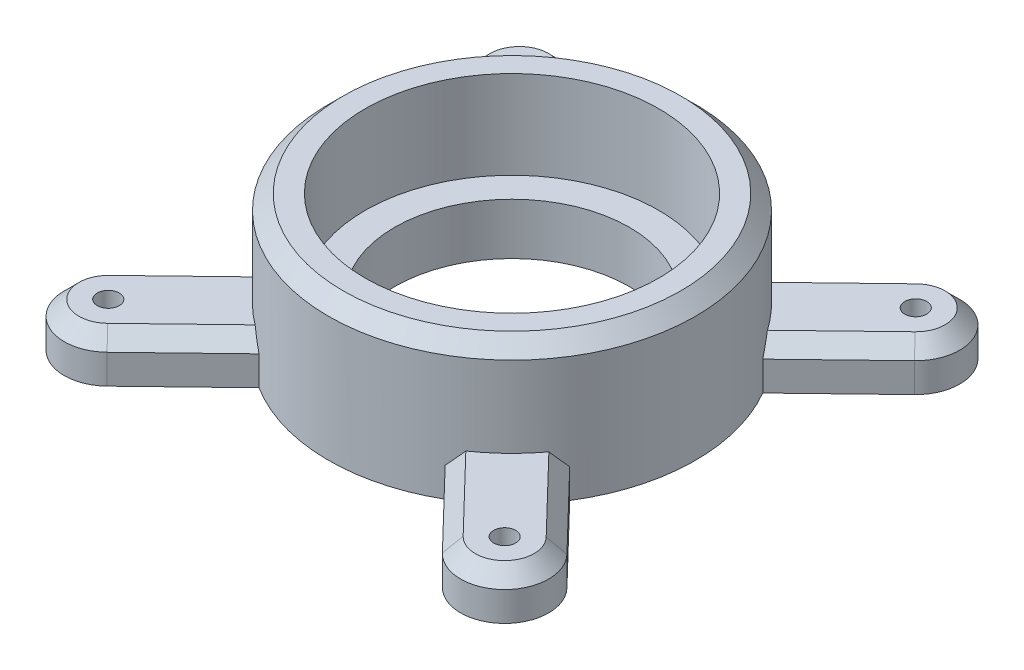
ISO-10303-21;
HEADER;
FILE_DESCRIPTION(('STEP AP214'),'2;1');
FILE_NAME('part.step','',(''),(''),'','','');
FILE_SCHEMA(('AUTOMOTIVE_DESIGN { 1 0 10303 214 1 1 1 1 }'));
ENDSEC;
DATA;
#1=APPLICATION_CONTEXT('core data for automotive mechanical design processes');
#2=APPLICATION_PROTOCOL_DEFINITION('international standard','automotive_design',2000,#1);
#3=PRODUCT_CONTEXT('',#1,'mechanical');
#4=PRODUCT('Part','Part','',(#3));
#5=PRODUCT_RELATED_PRODUCT_CATEGORY('part','',(#4));
#6=PRODUCT_DEFINITION_FORMATION('','',#4);
#7=PRODUCT_DEFINITION_CONTEXT('part definition',#1,'design');
#8=PRODUCT_DEFINITION('design','',#6,#7);
#9=PRODUCT_DEFINITION_SHAPE('','',#8);
#10=(LENGTH_UNIT() NAMED_UNIT(*) SI_UNIT(.MILLI.,.METRE.));
#11=(NAMED_UNIT(*) PLANE_ANGLE_UNIT() SI_UNIT($,.RADIAN.));
#12=(NAMED_UNIT(*) SI_UNIT($,.STERADIAN.) SOLID_ANGLE_UNIT());
#13=UNCERTAINTY_MEASURE_WITH_UNIT(LENGTH_MEASURE(1.E-05),#10,'distance_accuracy_value','');
#14=(GEOMETRIC_REPRESENTATION_CONTEXT(3) GLOBAL_UNCERTAINTY_ASSIGNED_CONTEXT((#13)) GLOBAL_UNIT_ASSIGNED_CONTEXT((#10,
#11,#12)) REPRESENTATION_CONTEXT('',''));
#15=CARTESIAN_POINT('',(0.,0.,0.));
#16=DIRECTION('',(0.,0.,1.));
#17=DIRECTION('',(1.,0.,0.));
#18=AXIS2_PLACEMENT_3D('',#15,#16,#17);
#19=CARTESIAN_POINT('',(-27.,0.,-28.));
#20=DIRECTION('',(0.,1.,0.));
#21=DIRECTION('',(0.,0.,1.));
#22=AXIS2_PLACEMENT_3D('',#19,#20,#21);
#23=PLANE('',#22);
#24=CARTESIAN_POINT('',(28.0000000000001,0.,-26.9999999999999));
#25=DIRECTION('',(0.,-1.,0.));
#26=DIRECTION('',(0.,0.,-1.));
#27=AXIS2_PLACEMENT_3D('',#24,#25,#26);
#28=CIRCLE('',#27,1.49999999999999);
#29=CARTESIAN_POINT('',(28.0000000000001,0.,-28.4999999999999));
#30=VERTEX_POINT('',#29);
#31=EDGE_CURVE('E661',#30,#30,#28,.T.);
#32=ORIENTED_EDGE('',*,*,#31,.F.);
#33=EDGE_LOOP('',(#32));
#34=FACE_BOUND('',#33,.T.);
#35=CARTESIAN_POINT('',(26.9999999999998,0.,28.0000000000002));
#36=DIRECTION('',(0.,-1.,0.));
#37=DIRECTION('',(0.,0.,-1.));
#38=AXIS2_PLACEMENT_3D('',#35,#36,#37);
#39=CIRCLE('',#38,1.49999999999999);
#40=CARTESIAN_POINT('',(26.9999999999998,0.,26.5000000000002));
#41=VERTEX_POINT('',#40);
#42=EDGE_CURVE('E671',#41,#41,#39,.T.);
#43=ORIENTED_EDGE('',*,*,#42,.F.);
#44=EDGE_LOOP('',(#43));
#45=FACE_BOUND('',#44,.T.);
#46=CARTESIAN_POINT('',(-28.0000000000003,0.,26.9999999999997));
#47=DIRECTION('',(0.,-1.,0.));
#48=DIRECTION('',(0.,0.,-1.));
#49=AXIS2_PLACEMENT_3D('',#46,#47,#48);
#50=CIRCLE('',#49,1.49999999999999);
#51=CARTESIAN_POINT('',(-28.0000000000003,0.,25.4999999999997));
#52=VERTEX_POINT('',#51);
#53=EDGE_CURVE('E679',#52,#52,#50,.T.);
#54=ORIENTED_EDGE('',*,*,#53,.F.);
#55=EDGE_LOOP('',(#54));
#56=FACE_BOUND('',#55,.T.);
#57=CARTESIAN_POINT('',(0.,0.,0.));
#58=DIRECTION('',(0.,1.,0.));
#59=DIRECTION('',(0.,0.,1.));
#60=AXIS2_PLACEMENT_3D('',#57,#58,#59);
#61=CIRCLE('',#60,16.);
#62=CARTESIAN_POINT('',(0.,0.,16.));
#63=VERTEX_POINT('',#62);
#64=EDGE_CURVE('E344',#63,#63,#61,.T.);
#65=ORIENTED_EDGE('',*,*,#64,.T.);
#66=EDGE_LOOP('',(#65));
#67=FACE_BOUND('',#66,.T.);
#68=CARTESIAN_POINT('',(-27.,0.,-28.));
#69=DIRECTION('',(0.,1.,0.));
#70=DIRECTION('',(0.,0.,1.));
#71=AXIS2_PLACEMENT_3D('',#68,#69,#70);
#72=CIRCLE('',#71,6.00000000000002);
#73=CARTESIAN_POINT('',(-22.6809342274759,0.,-32.1648134235054));
#74=VERTEX_POINT('',#73);
#75=CARTESIAN_POINT('',(-31.3190657725241,0.,-23.8351865764946));
#76=VERTEX_POINT('',#75);
#77=EDGE_CURVE('E227',#74,#76,#72,.T.);
#78=ORIENTED_EDGE('',*,*,#77,.F.);
#79=DIRECTION('',(-0.694135570584231,0.,-0.719844295420686));
#80=VECTOR('',#79,1.);
#81=CARTESIAN_POINT('',(-12.5271340397874,0.,-21.6349465621988));
#82=LINE('',#81,#80);
#83=CARTESIAN_POINT('',(-12.5271340397874,0.,-21.6349465621989));
#84=VERTEX_POINT('',#83);
#85=EDGE_CURVE('E298',#84,#74,#82,.T.);
#86=ORIENTED_EDGE('',*,*,#85,.F.);
#87=CARTESIAN_POINT('',(0.,0.,0.));
#88=DIRECTION('',(0.,1.,0.));
#89=DIRECTION('',(0.,0.,1.));
#90=AXIS2_PLACEMENT_3D('',#87,#88,#89);
#91=CIRCLE('',#90,25.);
#92=CARTESIAN_POINT('',(13.3053197151881,0.,-21.1652655848356));
#93=VERTEX_POINT('',#92);
#94=EDGE_CURVE('E294',#93,#84,#91,.T.);
#95=ORIENTED_EDGE('',*,*,#94,.F.);
#96=DIRECTION('',(-0.719844295420688,0.,0.694135570584229));
#97=VECTOR('',#96,1.);
#98=CARTESIAN_POINT('',(13.3053197151881,0.,-21.1652655848356));
#99=LINE('',#98,#97);
#100=CARTESIAN_POINT('',(23.8351865764947,0.,-31.319065772524));
#101=VERTEX_POINT('',#100);
#102=EDGE_CURVE('E290',#101,#93,#99,.T.);
#103=ORIENTED_EDGE('',*,*,#102,.F.);
#104=CARTESIAN_POINT('',(28.0000000000001,0.,-26.9999999999999));
#105=DIRECTION('',(0.,1.,0.));
#106=DIRECTION('',(0.,0.,1.));
#107=AXIS2_PLACEMENT_3D('',#104,#105,#106);
#108=CIRCLE('',#107,6.);
#109=CARTESIAN_POINT('',(32.1648134235055,0.,-22.6809342274758));
#110=VERTEX_POINT('',#109);
#111=EDGE_CURVE('E286',#110,#101,#108,.T.);
#112=ORIENTED_EDGE('',*,*,#111,.F.);
#113=DIRECTION('',(0.719844295420687,0.,-0.69413557058423));
#114=VECTOR('',#113,1.);
#115=CARTESIAN_POINT('',(21.6349465621989,0.,-12.5271340397873));
#116=LINE('',#115,#114);
#117=CARTESIAN_POINT('',(21.6349465621989,0.,-12.5271340397873));
#118=VERTEX_POINT('',#117);
#119=EDGE_CURVE('E282',#118,#110,#116,.T.);
#120=ORIENTED_EDGE('',*,*,#119,.F.);
#121=CARTESIAN_POINT('',(0.,0.,0.));
#122=DIRECTION('',(0.,1.,0.));
#123=DIRECTION('',(0.,0.,1.));
#124=AXIS2_PLACEMENT_3D('',#121,#122,#123);
#125=CIRCLE('',#124,25.);
#126=CARTESIAN_POINT('',(21.165265584836,0.,13.3053197151874));
#127=VERTEX_POINT('',#126);
#128=EDGE_CURVE('E278',#127,#118,#125,.T.);
#129=ORIENTED_EDGE('',*,*,#128,.F.);
#130=DIRECTION('',(-0.694135570584231,0.,-0.719844295420686));
#131=VECTOR('',#130,1.);
#132=CARTESIAN_POINT('',(21.165265584836,0.,13.3053197151874));
#133=LINE('',#132,#131);
#134=CARTESIAN_POINT('',(31.3190657725238,0.,23.8351865764947));
#135=VERTEX_POINT('',#134);
#136=EDGE_CURVE('E274',#135,#127,#133,.T.);
#137=ORIENTED_EDGE('',*,*,#136,.F.);
#138=CARTESIAN_POINT('',(26.9999999999998,0.,28.0000000000002));
#139=DIRECTION('',(0.,1.,0.));
#140=DIRECTION('',(0.,0.,1.));
#141=AXIS2_PLACEMENT_3D('',#138,#139,#140);
#142=CIRCLE('',#141,6.00000000000002);
#143=CARTESIAN_POINT('',(22.6809342274763,0.,32.1648134235048));
#144=VERTEX_POINT('',#143);
#145=EDGE_CURVE('E270',#144,#135,#142,.T.);
#146=ORIENTED_EDGE('',*,*,#145,.F.);
#147=DIRECTION('',(0.694135570584231,0.,0.719844295420686));
#148=VECTOR('',#147,1.);
#149=CARTESIAN_POINT('',(12.5271340397878,0.,21.6349465621982));
#150=LINE('',#149,#148);
#151=CARTESIAN_POINT('',(12.5271340397879,0.,21.6349465621984));
#152=VERTEX_POINT('',#151);
#153=EDGE_CURVE('E266',#152,#144,#150,.T.);
#154=ORIENTED_EDGE('',*,*,#153,.F.);
#155=CARTESIAN_POINT('',(0.,0.,0.));
#156=DIRECTION('',(0.,1.,0.));
#157=DIRECTION('',(0.,0.,1.));
#158=AXIS2_PLACEMENT_3D('',#155,#156,#157);
#159=CIRCLE('',#158,24.9999999999998);
#160=CARTESIAN_POINT('',(-13.3053197151883,0.,21.1652655848355));
#161=VERTEX_POINT('',#160);
#162=EDGE_CURVE('E262',#161,#152,#159,.T.);
#163=ORIENTED_EDGE('',*,*,#162,.F.);
#164=DIRECTION('',(0.719844295420659,0.,-0.694135570584259));
#165=VECTOR('',#164,1.);
#166=CARTESIAN_POINT('',(-13.3053197151883,0.,21.1652655848355));
#167=LINE('',#166,#165);
#168=CARTESIAN_POINT('',(-23.8351865764946,0.,31.3190657725235));
#169=VERTEX_POINT('',#168);
#170=EDGE_CURVE('E258',#169,#161,#167,.T.);
#171=ORIENTED_EDGE('',*,*,#170,.F.);
#172=CARTESIAN_POINT('',(-28.0000000000003,0.,26.9999999999997));
#173=DIRECTION('',(0.,1.,0.));
#174=DIRECTION('',(0.,0.,1.));
#175=AXIS2_PLACEMENT_3D('',#172,#173,#174);
#176=CIRCLE('',#175,6.00000000000002);
#177=CARTESIAN_POINT('',(-32.1648134235049,0.,22.6809342274758));
#178=VERTEX_POINT('',#177);
#179=EDGE_CURVE('E254',#178,#169,#176,.T.);
#180=ORIENTED_EDGE('',*,*,#179,.F.);
#181=DIRECTION('',(-0.719844295420661,0.,0.694135570584257));
#182=VECTOR('',#181,1.);
#183=CARTESIAN_POINT('',(-21.634946562199,0.,12.5271340397872));
#184=LINE('',#183,#182);
#185=CARTESIAN_POINT('',(-21.634946562199,0.,12.5271340397872));
#186=VERTEX_POINT('',#185);
#187=EDGE_CURVE('E250',#186,#178,#184,.T.);
#188=ORIENTED_EDGE('',*,*,#187,.F.);
#189=CARTESIAN_POINT('',(0.,0.,0.));
#190=DIRECTION('',(0.,1.,0.));
#191=DIRECTION('',(0.,0.,1.));
#192=AXIS2_PLACEMENT_3D('',#189,#190,#191);
#193=CIRCLE('',#192,25.);
#194=CARTESIAN_POINT('',(-21.1652655848356,0.,-13.3053197151881));
#195=VERTEX_POINT('',#194);
#196=EDGE_CURVE('E230',#195,#186,#193,.T.);
#197=ORIENTED_EDGE('',*,*,#196,.F.);
#198=DIRECTION('',(0.694135570584232,0.,0.719844295420685));
#199=VECTOR('',#198,1.);
#200=CARTESIAN_POINT('',(-21.1652655848356,0.,-13.3053197151881));
#201=LINE('',#200,#199);
#202=EDGE_CURVE('E214',#76,#195,#201,.T.);
#203=ORIENTED_EDGE('',*,*,#202,.F.);
#204=EDGE_LOOP('',(#78,#86,#95,#103,#112,#120,#129,#137,#146,#154,#163,#171,#180,#188,#197,#203));
#205=FACE_BOUND('',#204,.T.);
#206=CARTESIAN_POINT('',(-27.,0.,-28.));
#207=DIRECTION('',(0.,-1.,0.));
#208=DIRECTION('',(0.,0.,-1.));
#209=AXIS2_PLACEMENT_3D('',#206,#207,#208);
#210=CIRCLE('',#209,1.49999999999999);
#211=CARTESIAN_POINT('',(-27.,0.,-29.5));
#212=VERTEX_POINT('',#211);
#213=EDGE_CURVE('E461',#212,#212,#210,.T.);
#214=ORIENTED_EDGE('',*,*,#213,.F.);
#215=EDGE_LOOP('',(#214));
#216=FACE_BOUND('',#215,.T.);
#217=ADVANCED_FACE('F49',(#34,#45,#56,#67,#205,#216),#23,.F.);
#218=CARTESIAN_POINT('',(-27.,6.,-28.));
#219=DIRECTION('',(0.,1.,0.));
#220=DIRECTION('',(0.,0.,1.));
#221=AXIS2_PLACEMENT_3D('',#218,#219,#220);
#222=PLANE('',#221);
#223=CARTESIAN_POINT('',(26.9999999999998,6.,28.0000000000002));
#224=DIRECTION('',(0.,1.,0.));
#225=DIRECTION('',(0.,0.,1.));
#226=AXIS2_PLACEMENT_3D('',#223,#224,#225);
#227=CIRCLE('',#226,1.49999999999999);
#228=CARTESIAN_POINT('',(26.9999999999998,6.,29.5000000000002));
#229=VERTEX_POINT('',#228);
#230=EDGE_CURVE('E675',#229,#229,#227,.T.);
#231=ORIENTED_EDGE('',*,*,#230,.F.);
#232=EDGE_LOOP('',(#231));
#233=FACE_BOUND('',#232,.T.);
#234=CARTESIAN_POINT('',(26.9999999999998,6.,28.0000000000002));
#235=DIRECTION('',(0.,1.,0.));
#236=DIRECTION('',(0.,0.,1.));
#237=AXIS2_PLACEMENT_3D('',#234,#235,#236);
#238=CIRCLE('',#237,4.00000000000002);
#239=CARTESIAN_POINT('',(24.1206228183177,6.,30.7765422823364));
#240=VERTEX_POINT('',#239);
#241=CARTESIAN_POINT('',(29.8793771816824,6.,25.2234577176631));
#242=VERTEX_POINT('',#241);
#243=EDGE_CURVE('E380',#240,#242,#238,.T.);
#244=ORIENTED_EDGE('',*,*,#243,.T.);
#245=DIRECTION('',(-0.694135570584231,0.,-0.719844295420686));
#246=VECTOR('',#245,1.);
#247=CARTESIAN_POINT('',(19.7255769939947,6.,14.6935908563559));
#248=LINE('',#247,#246);
#249=CARTESIAN_POINT('',(20.0092029812449,6.,14.9877215098006));
#250=VERTEX_POINT('',#249);
#251=EDGE_CURVE('E383',#242,#250,#248,.T.);
#252=ORIENTED_EDGE('',*,*,#251,.T.);
#253=CARTESIAN_POINT('',(0.,6.,0.));
#254=DIRECTION('',(0.,1.,0.));
#255=DIRECTION('',(0.,0.,1.));
#256=AXIS2_PLACEMENT_3D('',#253,#254,#255);
#257=CIRCLE('',#256,25.);
#258=CARTESIAN_POINT('',(14.2504486178796,6.,20.5408060744746));
#259=VERTEX_POINT('',#258);
#260=EDGE_CURVE('E238',#259,#250,#257,.T.);
#261=ORIENTED_EDGE('',*,*,#260,.F.);
#262=DIRECTION('',(0.694135570584231,0.,0.719844295420686));
#263=VECTOR('',#262,1.);
#264=CARTESIAN_POINT('',(24.1206228183176,6.,30.7765422823363));
#265=LINE('',#264,#263);
#266=EDGE_CURVE('E377',#259,#240,#265,.T.);
#267=ORIENTED_EDGE('',*,*,#266,.T.);
#268=EDGE_LOOP('',(#244,#252,#261,#267));
#269=FACE_BOUND('',#268,.T.);
#270=ADVANCED_FACE('F543',(#233,#269),#222,.T.);
#271=CARTESIAN_POINT('',(28.0000000000001,6.,-26.9999999999999));
#272=DIRECTION('',(0.,1.,0.));
#273=DIRECTION('',(0.,0.,1.));
#274=AXIS2_PLACEMENT_3D('',#271,#272,#273);
#275=CIRCLE('',#274,1.49999999999999);
#276=CARTESIAN_POINT('',(28.0000000000001,6.,-25.4999999999999));
#277=VERTEX_POINT('',#276);
#278=EDGE_CURVE('E667',#277,#277,#275,.T.);
#279=ORIENTED_EDGE('',*,*,#278,.F.);
#280=EDGE_LOOP('',(#279));
#281=FACE_BOUND('',#280,.T.);
#282=CARTESIAN_POINT('',(20.5408060744751,6.,-14.2504486178789));
#283=VERTEX_POINT('',#282);
#284=CARTESIAN_POINT('',(14.9877215098013,6.,-20.0092029812444));
#285=VERTEX_POINT('',#284);
#286=EDGE_CURVE('E244',#283,#285,#257,.T.);
#287=ORIENTED_EDGE('',*,*,#286,.F.);
#288=DIRECTION('',(0.719844295420687,0.,-0.69413557058423));
#289=VECTOR('',#288,1.);
#290=CARTESIAN_POINT('',(30.776542282337,6.,-24.1206228183171));
#291=LINE('',#290,#289);
#292=CARTESIAN_POINT('',(30.776542282337,6.,-24.1206228183171));
#293=VERTEX_POINT('',#292);
#294=EDGE_CURVE('E364',#283,#293,#291,.T.);
#295=ORIENTED_EDGE('',*,*,#294,.T.);
#296=CARTESIAN_POINT('',(28.0000000000001,6.,-26.9999999999999));
#297=DIRECTION('',(0.,1.,0.));
#298=DIRECTION('',(0.,0.,1.));
#299=AXIS2_PLACEMENT_3D('',#296,#297,#298);
#300=CIRCLE('',#299,3.99999999999999);
#301=CARTESIAN_POINT('',(25.2234577176632,6.,-29.8793771816826));
#302=VERTEX_POINT('',#301);
#303=EDGE_CURVE('E361',#293,#302,#300,.T.);
#304=ORIENTED_EDGE('',*,*,#303,.T.);
#305=DIRECTION('',(-0.719844295420688,0.,0.694135570584229));
#306=VECTOR('',#305,1.);
#307=CARTESIAN_POINT('',(14.6935908563566,6.,-19.7255769939942));
#308=LINE('',#307,#306);
#309=EDGE_CURVE('E358',#302,#285,#308,.T.);
#310=ORIENTED_EDGE('',*,*,#309,.T.);
#311=EDGE_LOOP('',(#287,#295,#304,#310));
#312=FACE_BOUND('',#311,.T.);
#313=ADVANCED_FACE('F575',(#281,#312),#222,.T.);
#314=CARTESIAN_POINT('',(-27.,6.,-28.));
#315=DIRECTION('',(0.,1.,0.));
#316=DIRECTION('',(0.,0.,1.));
#317=AXIS2_PLACEMENT_3D('',#314,#315,#316);
#318=CIRCLE('',#317,1.49999999999999);
#319=CARTESIAN_POINT('',(-27.,6.,-26.5));
#320=VERTEX_POINT('',#319);
#321=EDGE_CURVE('E655',#320,#320,#318,.T.);
#322=ORIENTED_EDGE('',*,*,#321,.F.);
#323=EDGE_LOOP('',(#322));
#324=FACE_BOUND('',#323,.T.);
#325=CARTESIAN_POINT('',(-14.250448617879,6.,-20.540806074475));
#326=VERTEX_POINT('',#325);
#327=CARTESIAN_POINT('',(-20.0092029812445,6.,-14.9877215098012));
#328=VERTEX_POINT('',#327);
#329=EDGE_CURVE('E245',#326,#328,#257,.T.);
#330=ORIENTED_EDGE('',*,*,#329,.F.);
#331=DIRECTION('',(-0.694135570584231,0.,-0.719844295420686));
#332=VECTOR('',#331,1.);
#333=CARTESIAN_POINT('',(-24.1206228183172,6.,-30.7765422823369));
#334=LINE('',#333,#332);
#335=CARTESIAN_POINT('',(-24.1206228183172,6.,-30.7765422823369));
#336=VERTEX_POINT('',#335);
#337=EDGE_CURVE('E421',#326,#336,#334,.T.);
#338=ORIENTED_EDGE('',*,*,#337,.T.);
#339=CARTESIAN_POINT('',(-27.,6.,-28.));
#340=DIRECTION('',(0.,1.,0.));
#341=DIRECTION('',(0.,0.,1.));
#342=AXIS2_PLACEMENT_3D('',#339,#340,#341);
#343=CIRCLE('',#342,4.00000000000001);
#344=CARTESIAN_POINT('',(-29.8793771816827,6.,-25.2234577176631));
#345=VERTEX_POINT('',#344);
#346=EDGE_CURVE('E418',#336,#345,#343,.T.);
#347=ORIENTED_EDGE('',*,*,#346,.T.);
#348=DIRECTION('',(0.694135570584232,0.,0.719844295420685));
#349=VECTOR('',#348,1.);
#350=CARTESIAN_POINT('',(-19.7255769939943,6.,-14.6935908563565));
#351=LINE('',#350,#349);
#352=EDGE_CURVE('E415',#345,#328,#351,.T.);
#353=ORIENTED_EDGE('',*,*,#352,.T.);
#354=EDGE_LOOP('',(#330,#338,#347,#353));
#355=FACE_BOUND('',#354,.T.);
#356=ADVANCED_FACE('F492',(#324,#355),#222,.T.);
#357=CARTESIAN_POINT('',(-27.,6.,-28.));
#358=DIRECTION('',(0.,-1.,0.));
#359=DIRECTION('',(0.,0.,-1.));
#360=AXIS2_PLACEMENT_3D('',#357,#358,#359);
#361=CYLINDRICAL_SURFACE('',#360,6.00000000000002);
#362=DIRECTION('',(0.,-1.,0.));
#363=VECTOR('',#362,1.);
#364=CARTESIAN_POINT('',(-31.3190657725241,6.,-23.8351865764946));
#365=LINE('',#364,#363);
#366=CARTESIAN_POINT('',(-31.3190657725241,3.99999999999998,-23.8351865764946));
#367=VERTEX_POINT('',#366);
#368=EDGE_CURVE('E211',#367,#76,#365,.T.);
#369=ORIENTED_EDGE('',*,*,#368,.F.);
#370=CARTESIAN_POINT('',(-27.,3.99999999999998,-28.));
#371=DIRECTION('',(0.,1.,0.));
#372=DIRECTION('',(0.,0.,1.));
#373=AXIS2_PLACEMENT_3D('',#370,#371,#372);
#374=CIRCLE('',#373,6.00000000000002);
#375=CARTESIAN_POINT('',(-22.6809342274759,3.99999999999998,-32.1648134235054));
#376=VERTEX_POINT('',#375);
#377=EDGE_CURVE('E428',#367,#376,#374,.F.);
#378=ORIENTED_EDGE('',*,*,#377,.T.);
#379=DIRECTION('',(0.,-1.,0.));
#380=VECTOR('',#379,1.);
#381=CARTESIAN_POINT('',(-22.6809342274759,6.,-32.1648134235054));
#382=LINE('',#381,#380);
#383=EDGE_CURVE('E235',#376,#74,#382,.T.);
#384=ORIENTED_EDGE('',*,*,#383,.T.);
#385=ORIENTED_EDGE('',*,*,#77,.T.);
#386=EDGE_LOOP('',(#369,#378,#384,#385));
#387=FACE_BOUND('',#386,.T.);
#388=ADVANCED_FACE('F233',(#387),#361,.T.);
#389=CARTESIAN_POINT('',(-21.1652655848356,6.,-13.3053197151881));
#390=DIRECTION('',(0.719844295420685,0.,-0.694135570584232));
#391=DIRECTION('',(-0.694135570584232,0.,-0.719844295420685));
#392=AXIS2_PLACEMENT_3D('',#389,#390,#391);
#393=PLANE('',#392);
#394=DIRECTION('',(0.,-1.,0.));
#395=VECTOR('',#394,1.);
#396=CARTESIAN_POINT('',(-21.1652655848356,6.,-13.3053197151881));
#397=LINE('',#396,#395);
#398=CARTESIAN_POINT('',(-21.1652655848356,3.99999999999998,-13.3053197151881));
#399=VERTEX_POINT('',#398);
#400=EDGE_CURVE('E221',#399,#195,#397,.T.);
#401=ORIENTED_EDGE('',*,*,#400,.F.);
#402=DIRECTION('',(-0.694135570584232,0.,-0.719844295420685));
#403=VECTOR('',#402,1.);
#404=CARTESIAN_POINT('',(-31.3190657725241,3.99999999999998,-23.8351865764946));
#405=LINE('',#404,#403);
#406=EDGE_CURVE('E73',#399,#367,#405,.T.);
#407=ORIENTED_EDGE('',*,*,#406,.T.);
#408=ORIENTED_EDGE('',*,*,#368,.T.);
#409=ORIENTED_EDGE('',*,*,#202,.T.);
#410=EDGE_LOOP('',(#401,#407,#408,#409));
#411=FACE_BOUND('',#410,.T.);
#412=ADVANCED_FACE('F213',(#411),#393,.F.);
#413=CARTESIAN_POINT('',(-21.634946562199,6.,12.5271340397872));
#414=DIRECTION('',(0.694135570584257,0.,0.719844295420661));
#415=DIRECTION('',(0.719844295420661,0.,-0.694135570584257));
#416=AXIS2_PLACEMENT_3D('',#413,#414,#415);
#417=PLANE('',#416);
#418=DIRECTION('',(0.,-1.,0.));
#419=VECTOR('',#418,1.);
#420=CARTESIAN_POINT('',(-32.1648134235049,6.,22.6809342274758));
#421=LINE('',#420,#419);
#422=CARTESIAN_POINT('',(-32.1648134235049,3.99999999999998,22.6809342274758));
#423=VERTEX_POINT('',#422);
#424=EDGE_CURVE('E336',#423,#178,#421,.T.);
#425=ORIENTED_EDGE('',*,*,#424,.F.);
#426=DIRECTION('',(0.719844295420661,0.,-0.694135570584257));
#427=VECTOR('',#426,1.);
#428=CARTESIAN_POINT('',(-21.634946562199,3.99999999999998,12.5271340397872));
#429=LINE('',#428,#427);
#430=CARTESIAN_POINT('',(-21.634946562199,3.99999999999998,12.5271340397872));
#431=VERTEX_POINT('',#430);
#432=EDGE_CURVE('E412',#423,#431,#429,.T.);
#433=ORIENTED_EDGE('',*,*,#432,.T.);
#434=DIRECTION('',(0.,-1.,0.));
#435=VECTOR('',#434,1.);
#436=CARTESIAN_POINT('',(-21.634946562199,6.,12.5271340397872));
#437=LINE('',#436,#435);
#438=EDGE_CURVE('E339',#431,#186,#437,.T.);
#439=ORIENTED_EDGE('',*,*,#438,.T.);
#440=ORIENTED_EDGE('',*,*,#187,.T.);
#441=EDGE_LOOP('',(#425,#433,#439,#440));
#442=FACE_BOUND('',#441,.T.);
#443=ADVANCED_FACE('F725',(#442),#417,.F.);
#444=CARTESIAN_POINT('',(-28.0000000000003,6.,26.9999999999997));
#445=DIRECTION('',(0.,-1.,0.));
#446=DIRECTION('',(0.,0.,-1.));
#447=AXIS2_PLACEMENT_3D('',#444,#445,#446);
#448=CYLINDRICAL_SURFACE('',#447,6.00000000000002);
#449=DIRECTION('',(0.,-1.,0.));
#450=VECTOR('',#449,1.);
#451=CARTESIAN_POINT('',(-23.8351865764946,6.,31.3190657725235));
#452=LINE('',#451,#450);
#453=CARTESIAN_POINT('',(-23.8351865764946,3.99999999999998,31.3190657725235));
#454=VERTEX_POINT('',#453);
#455=EDGE_CURVE('E333',#454,#169,#452,.T.);
#456=ORIENTED_EDGE('',*,*,#455,.F.);
#457=CARTESIAN_POINT('',(-28.0000000000003,3.99999999999998,26.9999999999997));
#458=DIRECTION('',(0.,1.,0.));
#459=DIRECTION('',(0.,0.,1.));
#460=AXIS2_PLACEMENT_3D('',#457,#458,#459);
#461=CIRCLE('',#460,6.00000000000002);
#462=EDGE_CURVE('E409',#454,#423,#461,.F.);
#463=ORIENTED_EDGE('',*,*,#462,.T.);
#464=ORIENTED_EDGE('',*,*,#424,.T.);
#465=ORIENTED_EDGE('',*,*,#179,.T.);
#466=EDGE_LOOP('',(#456,#463,#464,#465));
#467=FACE_BOUND('',#466,.T.);
#468=ADVANCED_FACE('F525',(#467),#448,.T.);
#469=CARTESIAN_POINT('',(-13.3053197151883,6.,21.1652655848355));
#470=DIRECTION('',(-0.694135570584259,0.,-0.719844295420659));
#471=DIRECTION('',(-0.719844295420659,0.,0.694135570584259));
#472=AXIS2_PLACEMENT_3D('',#469,#470,#471);
#473=PLANE('',#472);
#474=DIRECTION('',(0.,-1.,0.));
#475=VECTOR('',#474,1.);
#476=CARTESIAN_POINT('',(-13.3053197151883,6.,21.1652655848355));
#477=LINE('',#476,#475);
#478=CARTESIAN_POINT('',(-13.3053197151883,3.99999999999999,21.1652655848355));
#479=VERTEX_POINT('',#478);
#480=EDGE_CURVE('E330',#479,#161,#477,.T.);
#481=ORIENTED_EDGE('',*,*,#480,.F.);
#482=DIRECTION('',(-0.719844295420659,0.,0.694135570584259));
#483=VECTOR('',#482,1.);
#484=CARTESIAN_POINT('',(-23.8351865764941,3.99999999999999,31.319065772524));
#485=LINE('',#484,#483);
#486=EDGE_CURVE('E406',#479,#454,#485,.T.);
#487=ORIENTED_EDGE('',*,*,#486,.T.);
#488=ORIENTED_EDGE('',*,*,#455,.T.);
#489=ORIENTED_EDGE('',*,*,#170,.T.);
#490=EDGE_LOOP('',(#481,#487,#488,#489));
#491=FACE_BOUND('',#490,.T.);
#492=ADVANCED_FACE('F523',(#491),#473,.F.);
#493=CARTESIAN_POINT('',(12.5271340397878,6.,21.6349465621982));
#494=DIRECTION('',(0.719844295420686,0.,-0.694135570584231));
#495=DIRECTION('',(-0.694135570584231,0.,-0.719844295420686));
#496=AXIS2_PLACEMENT_3D('',#493,#494,#495);
#497=PLANE('',#496);
#498=DIRECTION('',(0.,-1.,0.));
#499=VECTOR('',#498,1.);
#500=CARTESIAN_POINT('',(22.6809342274763,6.,32.1648134235048));
#501=LINE('',#500,#499);
#502=CARTESIAN_POINT('',(22.6809342274763,3.99999999999999,32.1648134235048));
#503=VERTEX_POINT('',#502);
#504=EDGE_CURVE('E324',#503,#144,#501,.T.);
#505=ORIENTED_EDGE('',*,*,#504,.F.);
#506=DIRECTION('',(-0.694135570584231,0.,-0.719844295420686));
#507=VECTOR('',#506,1.);
#508=CARTESIAN_POINT('',(12.527134039788,3.99999999999999,21.6349465621985));
#509=LINE('',#508,#507);
#510=CARTESIAN_POINT('',(12.5271340397879,3.99999999999999,21.6349465621984));
#511=VERTEX_POINT('',#510);
#512=EDGE_CURVE('E393',#503,#511,#509,.T.);
#513=ORIENTED_EDGE('',*,*,#512,.T.);
#514=DIRECTION('',(0.,-1.,0.));
#515=VECTOR('',#514,1.);
#516=CARTESIAN_POINT('',(12.5271340397879,6.,21.6349465621984));
#517=LINE('',#516,#515);
#518=EDGE_CURVE('E327',#511,#152,#517,.T.);
#519=ORIENTED_EDGE('',*,*,#518,.T.);
#520=ORIENTED_EDGE('',*,*,#153,.T.);
#521=EDGE_LOOP('',(#505,#513,#519,#520));
#522=FACE_BOUND('',#521,.T.);
#523=ADVANCED_FACE('F561',(#522),#497,.F.);
#524=CARTESIAN_POINT('',(26.9999999999998,6.,28.0000000000002));
#525=DIRECTION('',(0.,-1.,0.));
#526=DIRECTION('',(0.,0.,-1.));
#527=AXIS2_PLACEMENT_3D('',#524,#525,#526);
#528=CYLINDRICAL_SURFACE('',#527,6.00000000000002);
#529=DIRECTION('',(0.,-1.,0.));
#530=VECTOR('',#529,1.);
#531=CARTESIAN_POINT('',(31.3190657725238,6.,23.8351865764947));
#532=LINE('',#531,#530);
#533=CARTESIAN_POINT('',(31.3190657725238,4.,23.8351865764947));
#534=VERTEX_POINT('',#533);
#535=EDGE_CURVE('E321',#534,#135,#532,.T.);
#536=ORIENTED_EDGE('',*,*,#535,.F.);
#537=CARTESIAN_POINT('',(26.9999999999998,4.,28.0000000000002));
#538=DIRECTION('',(0.,1.,0.));
#539=DIRECTION('',(0.,0.,1.));
#540=AXIS2_PLACEMENT_3D('',#537,#538,#539);
#541=CIRCLE('',#540,6.00000000000002);
#542=EDGE_CURVE('E390',#534,#503,#541,.F.);
#543=ORIENTED_EDGE('',*,*,#542,.T.);
#544=ORIENTED_EDGE('',*,*,#504,.T.);
#545=ORIENTED_EDGE('',*,*,#145,.T.);
#546=EDGE_LOOP('',(#536,#543,#544,#545));
#547=FACE_BOUND('',#546,.T.);
#548=ADVANCED_FACE('F560',(#547),#528,.T.);
#549=CARTESIAN_POINT('',(21.165265584836,6.,13.3053197151874));
#550=DIRECTION('',(-0.719844295420686,0.,0.694135570584231));
#551=DIRECTION('',(0.694135570584231,0.,0.719844295420686));
#552=AXIS2_PLACEMENT_3D('',#549,#550,#551);
#553=PLANE('',#552);
#554=DIRECTION('',(0.,-1.,0.));
#555=VECTOR('',#554,1.);
#556=CARTESIAN_POINT('',(21.165265584836,6.,13.3053197151874));
#557=LINE('',#556,#555);
#558=CARTESIAN_POINT('',(21.165265584836,4.,13.3053197151874));
#559=VERTEX_POINT('',#558);
#560=EDGE_CURVE('E318',#559,#127,#557,.T.);
#561=ORIENTED_EDGE('',*,*,#560,.F.);
#562=DIRECTION('',(0.694135570584231,0.,0.719844295420686));
#563=VECTOR('',#562,1.);
#564=CARTESIAN_POINT('',(31.3190657725245,4.,23.835186576494));
#565=LINE('',#564,#563);
#566=EDGE_CURVE('E387',#559,#534,#565,.T.);
#567=ORIENTED_EDGE('',*,*,#566,.T.);
#568=ORIENTED_EDGE('',*,*,#535,.T.);
#569=ORIENTED_EDGE('',*,*,#136,.T.);
#570=EDGE_LOOP('',(#561,#567,#568,#569));
#571=FACE_BOUND('',#570,.T.);
#572=ADVANCED_FACE('F550',(#571),#553,.F.);
#573=CARTESIAN_POINT('',(21.6349465621989,6.,-12.5271340397873));
#574=DIRECTION('',(-0.69413557058423,0.,-0.719844295420687));
#575=DIRECTION('',(-0.719844295420687,0.,0.69413557058423));
#576=AXIS2_PLACEMENT_3D('',#573,#574,#575);
#577=PLANE('',#576);
#578=DIRECTION('',(0.,-1.,0.));
#579=VECTOR('',#578,1.);
#580=CARTESIAN_POINT('',(32.1648134235055,6.,-22.6809342274758));
#581=LINE('',#580,#579);
#582=CARTESIAN_POINT('',(32.1648134235055,4.,-22.6809342274758));
#583=VERTEX_POINT('',#582);
#584=EDGE_CURVE('E312',#583,#110,#581,.T.);
#585=ORIENTED_EDGE('',*,*,#584,.F.);
#586=DIRECTION('',(-0.719844295420687,0.,0.69413557058423));
#587=VECTOR('',#586,1.);
#588=CARTESIAN_POINT('',(21.6349465621989,4.,-12.5271340397873));
#589=LINE('',#588,#587);
#590=CARTESIAN_POINT('',(21.6349465621989,4.,-12.5271340397873));
#591=VERTEX_POINT('',#590);
#592=EDGE_CURVE('E368',#583,#591,#589,.T.);
#593=ORIENTED_EDGE('',*,*,#592,.T.);
#594=DIRECTION('',(0.,-1.,0.));
#595=VECTOR('',#594,1.);
#596=CARTESIAN_POINT('',(21.6349465621989,6.,-12.5271340397873));
#597=LINE('',#596,#595);
#598=EDGE_CURVE('E315',#591,#118,#597,.T.);
#599=ORIENTED_EDGE('',*,*,#598,.T.);
#600=ORIENTED_EDGE('',*,*,#119,.T.);
#601=EDGE_LOOP('',(#585,#593,#599,#600));
#602=FACE_BOUND('',#601,.T.);
#603=ADVANCED_FACE('F967',(#602),#577,.F.);
#604=CARTESIAN_POINT('',(28.0000000000001,6.,-26.9999999999999));
#605=DIRECTION('',(0.,-1.,0.));
#606=DIRECTION('',(0.,0.,-1.));
#607=AXIS2_PLACEMENT_3D('',#604,#605,#606);
#608=CYLINDRICAL_SURFACE('',#607,6.);
#609=DIRECTION('',(0.,-1.,0.));
#610=VECTOR('',#609,1.);
#611=CARTESIAN_POINT('',(23.8351865764947,6.,-31.319065772524));
#612=LINE('',#611,#610);
#613=CARTESIAN_POINT('',(23.8351865764947,4.,-31.319065772524));
#614=VERTEX_POINT('',#613);
#615=EDGE_CURVE('E309',#614,#101,#612,.T.);
#616=ORIENTED_EDGE('',*,*,#615,.F.);
#617=CARTESIAN_POINT('',(28.0000000000001,4.,-26.9999999999999));
#618=DIRECTION('',(0.,1.,0.));
#619=DIRECTION('',(0.,0.,1.));
#620=AXIS2_PLACEMENT_3D('',#617,#618,#619);
#621=CIRCLE('',#620,6.);
#622=EDGE_CURVE('E371',#614,#583,#621,.F.);
#623=ORIENTED_EDGE('',*,*,#622,.T.);
#624=ORIENTED_EDGE('',*,*,#584,.T.);
#625=ORIENTED_EDGE('',*,*,#111,.T.);
#626=EDGE_LOOP('',(#616,#623,#624,#625));
#627=FACE_BOUND('',#626,.T.);
#628=ADVANCED_FACE('F588',(#627),#608,.T.);
#629=CARTESIAN_POINT('',(13.3053197151881,6.,-21.1652655848356));
#630=DIRECTION('',(0.694135570584229,0.,0.719844295420688));
#631=DIRECTION('',(0.719844295420688,0.,-0.694135570584229));
#632=AXIS2_PLACEMENT_3D('',#629,#630,#631);
#633=PLANE('',#632);
#634=DIRECTION('',(0.,-1.,0.));
#635=VECTOR('',#634,1.);
#636=CARTESIAN_POINT('',(13.3053197151881,6.,-21.1652655848356));
#637=LINE('',#636,#635);
#638=CARTESIAN_POINT('',(13.3053197151881,4.,-21.1652655848356));
#639=VERTEX_POINT('',#638);
#640=EDGE_CURVE('E306',#639,#93,#637,.T.);
#641=ORIENTED_EDGE('',*,*,#640,.F.);
#642=DIRECTION('',(0.719844295420688,0.,-0.694135570584229));
#643=VECTOR('',#642,1.);
#644=CARTESIAN_POINT('',(23.8351865764947,4.,-31.319065772524));
#645=LINE('',#644,#643);
#646=EDGE_CURVE('E374',#639,#614,#645,.T.);
#647=ORIENTED_EDGE('',*,*,#646,.T.);
#648=ORIENTED_EDGE('',*,*,#615,.T.);
#649=ORIENTED_EDGE('',*,*,#102,.T.);
#650=EDGE_LOOP('',(#641,#647,#648,#649));
#651=FACE_BOUND('',#650,.T.);
#652=ADVANCED_FACE('F586',(#651),#633,.F.);
#653=CARTESIAN_POINT('',(0.,6.,0.));
#654=DIRECTION('',(0.,-1.,0.));
#655=DIRECTION('',(0.,0.,-1.));
#656=AXIS2_PLACEMENT_3D('',#653,#654,#655);
#657=CYLINDRICAL_SURFACE('',#656,25.);
#658=CARTESIAN_POINT('',(0.,17.,0.));
#659=DIRECTION('',(0.,1.,0.));
#660=DIRECTION('',(0.,0.,1.));
#661=AXIS2_PLACEMENT_3D('',#658,#659,#660);
#662=CIRCLE('',#661,25.);
#663=CARTESIAN_POINT('',(0.,17.,25.));
#664=VERTEX_POINT('',#663);
#665=EDGE_CURVE('E354',#664,#664,#662,.F.);
#666=ORIENTED_EDGE('',*,*,#665,.T.);
#667=EDGE_LOOP('',(#666));
#668=FACE_BOUND('',#667,.T.);
#669=ORIENTED_EDGE('',*,*,#94,.T.);
#670=DIRECTION('',(0.,-1.,0.));
#671=VECTOR('',#670,1.);
#672=CARTESIAN_POINT('',(-12.5271340397874,6.,-21.6349465621989));
#673=LINE('',#672,#671);
#674=CARTESIAN_POINT('',(-12.5271340397874,3.99999999999998,-21.6349465621989));
#675=VERTEX_POINT('',#674);
#676=EDGE_CURVE('E303',#675,#84,#673,.T.);
#677=ORIENTED_EDGE('',*,*,#676,.F.);
#678=CARTESIAN_POINT('',(0.,9.99999999999999,0.));
#679=DIRECTION('',(0.50900678269042,0.707106781186547,-0.490827969022904));
#680=DIRECTION('',(0.509006782690419,-0.707106781186548,-0.490827969022903));
#681=AXIS2_PLACEMENT_3D('',#678,#679,#680);
#682=ELLIPSE('',#681,35.3553390593274,25.);
#683=EDGE_CURVE('E60',#675,#326,#682,.T.);
#684=ORIENTED_EDGE('',*,*,#683,.T.);
#685=ORIENTED_EDGE('',*,*,#329,.T.);
#686=CARTESIAN_POINT('',(0.,10.,0.));
#687=DIRECTION('',(-0.50900678269042,0.707106781186546,0.490827969022905));
#688=DIRECTION('',(-0.509006782690418,-0.707106781186549,0.490827969022903));
#689=AXIS2_PLACEMENT_3D('',#686,#687,#688);
#690=ELLIPSE('',#689,35.3553390593274,25.);
#691=EDGE_CURVE('E11',#328,#399,#690,.T.);
#692=ORIENTED_EDGE('',*,*,#691,.T.);
#693=ORIENTED_EDGE('',*,*,#400,.T.);
#694=ORIENTED_EDGE('',*,*,#196,.T.);
#695=ORIENTED_EDGE('',*,*,#438,.F.);
#696=CARTESIAN_POINT('',(0.,10.0000000000011,0.));
#697=DIRECTION('',(-0.490827969022922,0.707106781186547,-0.509006782690402));
#698=DIRECTION('',(-0.490827969022921,-0.707106781186548,-0.509006782690402));
#699=AXIS2_PLACEMENT_3D('',#696,#697,#698);
#700=ELLIPSE('',#699,35.3553390593274,25.);
#701=CARTESIAN_POINT('',(-20.5408060744752,6.,14.2504486178788));
#702=VERTEX_POINT('',#701);
#703=EDGE_CURVE('E448',#431,#702,#700,.T.);
#704=ORIENTED_EDGE('',*,*,#703,.T.);
#705=CARTESIAN_POINT('',(-14.9877215098014,6.,20.0092029812443));
#706=VERTEX_POINT('',#705);
#707=EDGE_CURVE('E220',#702,#706,#257,.T.);
#708=ORIENTED_EDGE('',*,*,#707,.T.);
#709=CARTESIAN_POINT('',(0.,9.99999999999886,0.));
#710=DIRECTION('',(0.490827969022924,0.707106781186545,0.509006782690402));
#711=DIRECTION('',(0.490827969022921,-0.70710678118655,0.509006782690399));
#712=AXIS2_PLACEMENT_3D('',#709,#710,#711);
#713=ELLIPSE('',#712,35.3553390593275,25.);
#714=EDGE_CURVE('E445',#706,#479,#713,.T.);
#715=ORIENTED_EDGE('',*,*,#714,.T.);
#716=ORIENTED_EDGE('',*,*,#480,.T.);
#717=ORIENTED_EDGE('',*,*,#162,.T.);
#718=ORIENTED_EDGE('',*,*,#518,.F.);
#719=CARTESIAN_POINT('',(0.,9.99999999999931,0.));
#720=DIRECTION('',(-0.509006782690421,0.707106781186545,0.490827969022905));
#721=DIRECTION('',(-0.509006782690418,-0.70710678118655,0.490827969022902));
#722=AXIS2_PLACEMENT_3D('',#719,#720,#721);
#723=ELLIPSE('',#722,35.3553390593275,25.);
#724=EDGE_CURVE('E442',#511,#259,#723,.T.);
#725=ORIENTED_EDGE('',*,*,#724,.T.);
#726=ORIENTED_EDGE('',*,*,#260,.T.);
#727=CARTESIAN_POINT('',(0.,10.0000000000008,0.));
#728=DIRECTION('',(0.50900678269042,0.707106781186546,-0.490827969022904));
#729=DIRECTION('',(0.509006782690418,-0.707106781186549,-0.490827969022903));
#730=AXIS2_PLACEMENT_3D('',#727,#728,#729);
#731=ELLIPSE('',#730,35.3553390593275,25.);
#732=EDGE_CURVE('E439',#250,#559,#731,.T.);
#733=ORIENTED_EDGE('',*,*,#732,.T.);
#734=ORIENTED_EDGE('',*,*,#560,.T.);
#735=ORIENTED_EDGE('',*,*,#128,.T.);
#736=ORIENTED_EDGE('',*,*,#598,.F.);
#737=CARTESIAN_POINT('',(0.,10.,0.));
#738=DIRECTION('',(0.490827969022902,0.707106781186548,0.50900678269042));
#739=DIRECTION('',(0.490827969022903,-0.707106781186547,0.509006782690421));
#740=AXIS2_PLACEMENT_3D('',#737,#738,#739);
#741=ELLIPSE('',#740,35.3553390593274,25.);
#742=EDGE_CURVE('E433',#591,#283,#741,.T.);
#743=ORIENTED_EDGE('',*,*,#742,.T.);
#744=ORIENTED_EDGE('',*,*,#286,.T.);
#745=CARTESIAN_POINT('',(0.,10.,0.));
#746=DIRECTION('',(-0.490827969022902,0.707106781186548,-0.50900678269042));
#747=DIRECTION('',(-0.490827969022902,-0.707106781186547,-0.509006782690421));
#748=AXIS2_PLACEMENT_3D('',#745,#746,#747);
#749=ELLIPSE('',#748,35.3553390593274,25.);
#750=EDGE_CURVE('E436',#285,#639,#749,.T.);
#751=ORIENTED_EDGE('',*,*,#750,.T.);
#752=ORIENTED_EDGE('',*,*,#640,.T.);
#753=EDGE_LOOP('',(#669,#677,#684,#685,#692,#693,#694,#695,#704,#708,#715,#716,#717,#718,#725,
#726,#733,#734,#735,#736,#743,#744,#751,#752));
#754=FACE_BOUND('',#753,.T.);
#755=ADVANCED_FACE('F493',(#668,#754),#657,.T.);
#756=CARTESIAN_POINT('',(-12.5271340397874,6.,-21.6349465621988));
#757=DIRECTION('',(-0.719844295420686,0.,0.694135570584231));
#758=DIRECTION('',(0.694135570584231,0.,0.719844295420686));
#759=AXIS2_PLACEMENT_3D('',#756,#757,#758);
#760=PLANE('',#759);
#761=ORIENTED_EDGE('',*,*,#383,.F.);
#762=DIRECTION('',(0.694135570584231,0.,0.719844295420686));
#763=VECTOR('',#762,1.);
#764=CARTESIAN_POINT('',(-12.5271340397874,3.99999999999998,-21.6349465621988));
#765=LINE('',#764,#763);
#766=EDGE_CURVE('E425',#376,#675,#765,.T.);
#767=ORIENTED_EDGE('',*,*,#766,.T.);
#768=ORIENTED_EDGE('',*,*,#676,.T.);
#769=ORIENTED_EDGE('',*,*,#85,.T.);
#770=EDGE_LOOP('',(#761,#767,#768,#769));
#771=FACE_BOUND('',#770,.T.);
#772=ADVANCED_FACE('F594',(#771),#760,.F.);
#773=CARTESIAN_POINT('',(-28.0000000000003,6.,26.9999999999997));
#774=DIRECTION('',(0.,1.,0.));
#775=DIRECTION('',(0.,0.,1.));
#776=AXIS2_PLACEMENT_3D('',#773,#774,#775);
#777=CIRCLE('',#776,1.49999999999999);
#778=CARTESIAN_POINT('',(-28.0000000000003,6.,28.4999999999997));
#779=VERTEX_POINT('',#778);
#780=EDGE_CURVE('E683',#779,#779,#777,.T.);
#781=ORIENTED_EDGE('',*,*,#780,.F.);
#782=EDGE_LOOP('',(#781));
#783=FACE_BOUND('',#782,.T.);
#784=CARTESIAN_POINT('',(-28.0000000000003,6.,26.9999999999997));
#785=DIRECTION('',(0.,1.,0.));
#786=DIRECTION('',(0.,0.,1.));
#787=AXIS2_PLACEMENT_3D('',#784,#785,#786);
#788=CIRCLE('',#787,4.00000000000001);
#789=CARTESIAN_POINT('',(-30.7765422823365,6.,24.1206228183172));
#790=VERTEX_POINT('',#789);
#791=CARTESIAN_POINT('',(-25.2234577176631,6.,29.8793771816822));
#792=VERTEX_POINT('',#791);
#793=EDGE_CURVE('E399',#790,#792,#788,.T.);
#794=ORIENTED_EDGE('',*,*,#793,.T.);
#795=DIRECTION('',(0.719844295420659,0.,-0.694135570584259));
#796=VECTOR('',#795,1.);
#797=CARTESIAN_POINT('',(-14.6935908563568,6.,19.7255769939942));
#798=LINE('',#797,#796);
#799=EDGE_CURVE('E402',#792,#706,#798,.T.);
#800=ORIENTED_EDGE('',*,*,#799,.T.);
#801=ORIENTED_EDGE('',*,*,#707,.F.);
#802=DIRECTION('',(-0.719844295420661,0.,0.694135570584257));
#803=VECTOR('',#802,1.);
#804=CARTESIAN_POINT('',(-30.7765422823364,6.,24.1206228183171));
#805=LINE('',#804,#803);
#806=EDGE_CURVE('E396',#702,#790,#805,.T.);
#807=ORIENTED_EDGE('',*,*,#806,.T.);
#808=EDGE_LOOP('',(#794,#800,#801,#807));
#809=FACE_BOUND('',#808,.T.);
#810=ADVANCED_FACE('F507',(#783,#809),#222,.T.);
#811=CARTESIAN_POINT('',(0.,19.,0.));
#812=DIRECTION('',(0.,1.,0.));
#813=DIRECTION('',(0.,0.,1.));
#814=AXIS2_PLACEMENT_3D('',#811,#812,#813);
#815=PLANE('',#814);
#816=CARTESIAN_POINT('',(0.,19.,0.));
#817=DIRECTION('',(0.,1.,0.));
#818=DIRECTION('',(0.,0.,1.));
#819=AXIS2_PLACEMENT_3D('',#816,#817,#818);
#820=CIRCLE('',#819,23.);
#821=CARTESIAN_POINT('',(0.,19.,23.));
#822=VERTEX_POINT('',#821);
#823=EDGE_CURVE('E350',#822,#822,#820,.T.);
#824=ORIENTED_EDGE('',*,*,#823,.T.);
#825=EDGE_LOOP('',(#824));
#826=FACE_BOUND('',#825,.T.);
#827=CARTESIAN_POINT('',(0.,19.,0.));
#828=DIRECTION('',(0.,1.,0.));
#829=DIRECTION('',(0.,0.,1.));
#830=AXIS2_PLACEMENT_3D('',#827,#828,#829);
#831=CIRCLE('',#830,20.);
#832=CARTESIAN_POINT('',(0.,19.,20.));
#833=VERTEX_POINT('',#832);
#834=EDGE_CURVE('E348',#833,#833,#831,.T.);
#835=ORIENTED_EDGE('',*,*,#834,.F.);
#836=EDGE_LOOP('',(#835));
#837=FACE_BOUND('',#836,.T.);
#838=ADVANCED_FACE('F601',(#826,#837),#815,.T.);
#839=CARTESIAN_POINT('',(0.,7.,0.));
#840=DIRECTION('',(0.,1.,0.));
#841=DIRECTION('',(0.,0.,1.));
#842=AXIS2_PLACEMENT_3D('',#839,#840,#841);
#843=CYLINDRICAL_SURFACE('',#842,20.);
#844=CARTESIAN_POINT('',(0.,7.,0.));
#845=DIRECTION('',(0.,1.,0.));
#846=DIRECTION('',(0.,0.,1.));
#847=AXIS2_PLACEMENT_3D('',#844,#845,#846);
#848=CIRCLE('',#847,20.);
#849=CARTESIAN_POINT('',(0.,7.,20.));
#850=VERTEX_POINT('',#849);
#851=EDGE_CURVE('E242',#850,#850,#848,.T.);
#852=ORIENTED_EDGE('',*,*,#851,.F.);
#853=EDGE_LOOP('',(#852));
#854=FACE_BOUND('',#853,.T.);
#855=ORIENTED_EDGE('',*,*,#834,.T.);
#856=EDGE_LOOP('',(#855));
#857=FACE_BOUND('',#856,.T.);
#858=ADVANCED_FACE('F620',(#854,#857),#843,.F.);
#859=CARTESIAN_POINT('',(0.,7.,0.));
#860=DIRECTION('',(0.,1.,0.));
#861=DIRECTION('',(0.,0.,1.));
#862=AXIS2_PLACEMENT_3D('',#859,#860,#861);
#863=PLANE('',#862);
#864=CARTESIAN_POINT('',(0.,7.,0.));
#865=DIRECTION('',(0.,1.,0.));
#866=DIRECTION('',(0.,0.,1.));
#867=AXIS2_PLACEMENT_3D('',#864,#865,#866);
#868=CIRCLE('',#867,16.);
#869=CARTESIAN_POINT('',(0.,7.,16.));
#870=VERTEX_POINT('',#869);
#871=EDGE_CURVE('E349',#870,#870,#868,.T.);
#872=ORIENTED_EDGE('',*,*,#871,.F.);
#873=EDGE_LOOP('',(#872));
#874=FACE_BOUND('',#873,.T.);
#875=ORIENTED_EDGE('',*,*,#851,.T.);
#876=EDGE_LOOP('',(#875));
#877=FACE_BOUND('',#876,.T.);
#878=ADVANCED_FACE('F624',(#874,#877),#863,.T.);
#879=CARTESIAN_POINT('',(0.,-12.,0.));
#880=DIRECTION('',(0.,1.,0.));
#881=DIRECTION('',(0.,0.,1.));
#882=AXIS2_PLACEMENT_3D('',#879,#880,#881);
#883=CYLINDRICAL_SURFACE('',#882,16.);
#884=ORIENTED_EDGE('',*,*,#871,.T.);
#885=EDGE_LOOP('',(#884));
#886=FACE_BOUND('',#885,.T.);
#887=ORIENTED_EDGE('',*,*,#64,.F.);
#888=EDGE_LOOP('',(#887));
#889=FACE_BOUND('',#888,.T.);
#890=ADVANCED_FACE('F628',(#886,#889),#883,.F.);
#891=CARTESIAN_POINT('',(-28.0000000000003,0.,26.9999999999997));
#892=DIRECTION('',(0.,-1.,0.));
#893=DIRECTION('',(0.,0.,-1.));
#894=AXIS2_PLACEMENT_3D('',#891,#892,#893);
#895=CYLINDRICAL_SURFACE('',#894,1.49999999999999);
#896=ORIENTED_EDGE('',*,*,#780,.T.);
#897=EDGE_LOOP('',(#896));
#898=FACE_BOUND('',#897,.T.);
#899=ORIENTED_EDGE('',*,*,#53,.T.);
#900=EDGE_LOOP('',(#899));
#901=FACE_BOUND('',#900,.T.);
#902=ADVANCED_FACE('F631',(#898,#901),#895,.F.);
#903=CARTESIAN_POINT('',(26.9999999999998,0.,28.0000000000002));
#904=DIRECTION('',(0.,-1.,0.));
#905=DIRECTION('',(0.,0.,-1.));
#906=AXIS2_PLACEMENT_3D('',#903,#904,#905);
#907=CYLINDRICAL_SURFACE('',#906,1.49999999999999);
#908=ORIENTED_EDGE('',*,*,#230,.T.);
#909=EDGE_LOOP('',(#908));
#910=FACE_BOUND('',#909,.T.);
#911=ORIENTED_EDGE('',*,*,#42,.T.);
#912=EDGE_LOOP('',(#911));
#913=FACE_BOUND('',#912,.T.);
#914=ADVANCED_FACE('F634',(#910,#913),#907,.F.);
#915=CARTESIAN_POINT('',(28.0000000000001,0.,-26.9999999999999));
#916=DIRECTION('',(0.,-1.,0.));
#917=DIRECTION('',(0.,0.,-1.));
#918=AXIS2_PLACEMENT_3D('',#915,#916,#917);
#919=CYLINDRICAL_SURFACE('',#918,1.49999999999999);
#920=ORIENTED_EDGE('',*,*,#278,.T.);
#921=EDGE_LOOP('',(#920));
#922=FACE_BOUND('',#921,.T.);
#923=ORIENTED_EDGE('',*,*,#31,.T.);
#924=EDGE_LOOP('',(#923));
#925=FACE_BOUND('',#924,.T.);
#926=ADVANCED_FACE('F638',(#922,#925),#919,.F.);
#927=CARTESIAN_POINT('',(-27.,0.,-28.));
#928=DIRECTION('',(0.,-1.,0.));
#929=DIRECTION('',(0.,0.,-1.));
#930=AXIS2_PLACEMENT_3D('',#927,#928,#929);
#931=CYLINDRICAL_SURFACE('',#930,1.49999999999999);
#932=ORIENTED_EDGE('',*,*,#321,.T.);
#933=EDGE_LOOP('',(#932));
#934=FACE_BOUND('',#933,.T.);
#935=ORIENTED_EDGE('',*,*,#213,.T.);
#936=EDGE_LOOP('',(#935));
#937=FACE_BOUND('',#936,.T.);
#938=ADVANCED_FACE('F642',(#934,#937),#931,.F.);
#939=CARTESIAN_POINT('',(0.,19.,0.));
#940=DIRECTION('',(0.,-1.,0.));
#941=DIRECTION('',(0.,0.,-1.));
#942=AXIS2_PLACEMENT_3D('',#939,#940,#941);
#943=CONICAL_SURFACE('',#942,23.,0.785398163397447);
#944=ORIENTED_EDGE('',*,*,#665,.F.);
#945=EDGE_LOOP('',(#944));
#946=FACE_BOUND('',#945,.T.);
#947=ORIENTED_EDGE('',*,*,#823,.F.);
#948=EDGE_LOOP('',(#947));
#949=FACE_BOUND('',#948,.T.);
#950=ADVANCED_FACE('F645',(#946,#949),#943,.T.);
#951=CARTESIAN_POINT('',(-2.77654228233703,6.,-2.87937718168265));
#952=DIRECTION('',(-0.490827969022902,0.707106781186548,-0.50900678269042));
#953=DIRECTION('',(0.719844295420688,0.,-0.694135570584229));
#954=AXIS2_PLACEMENT_3D('',#951,#952,#953);
#955=PLANE('',#954);
#956=ORIENTED_EDGE('',*,*,#750,.F.);
#957=ORIENTED_EDGE('',*,*,#309,.F.);
#958=DIRECTION('',(0.490827969022902,0.707106781186547,0.509006782690421));
#959=VECTOR('',#958,1.);
#960=CARTESIAN_POINT('',(23.8351865764947,4.,-31.319065772524));
#961=LINE('',#960,#959);
#962=EDGE_CURVE('E456',#614,#302,#961,.T.);
#963=ORIENTED_EDGE('',*,*,#962,.F.);
#964=ORIENTED_EDGE('',*,*,#646,.F.);
#965=EDGE_LOOP('',(#956,#957,#963,#964));
#966=FACE_BOUND('',#965,.T.);
#967=ADVANCED_FACE('F581',(#966),#955,.T.);
#968=CARTESIAN_POINT('',(28.0000000000001,6.,-26.9999999999999));
#969=DIRECTION('',(0.,-1.,0.));
#970=DIRECTION('',(0.,0.,-1.));
#971=AXIS2_PLACEMENT_3D('',#968,#969,#970);
#972=CONICAL_SURFACE('',#971,3.99999999999999,0.785398163397449);
#973=ORIENTED_EDGE('',*,*,#962,.T.);
#974=ORIENTED_EDGE('',*,*,#303,.F.);
#975=DIRECTION('',(-0.490827969022903,0.707106781186547,-0.50900678269042));
#976=VECTOR('',#975,1.);
#977=CARTESIAN_POINT('',(32.1648134235055,4.,-22.6809342274758));
#978=LINE('',#977,#976);
#979=EDGE_CURVE('E453',#583,#293,#978,.T.);
#980=ORIENTED_EDGE('',*,*,#979,.F.);
#981=ORIENTED_EDGE('',*,*,#622,.F.);
#982=EDGE_LOOP('',(#973,#974,#980,#981));
#983=FACE_BOUND('',#982,.T.);
#984=ADVANCED_FACE('F740',(#983),#972,.T.);
#985=CARTESIAN_POINT('',(2.77654228233683,6.,2.87937718168284));
#986=DIRECTION('',(0.490827969022902,0.707106781186548,0.50900678269042));
#987=DIRECTION('',(-0.719844295420687,0.,0.69413557058423));
#988=AXIS2_PLACEMENT_3D('',#985,#986,#987);
#989=PLANE('',#988);
#990=ORIENTED_EDGE('',*,*,#742,.F.);
#991=ORIENTED_EDGE('',*,*,#592,.F.);
#992=ORIENTED_EDGE('',*,*,#979,.T.);
#993=ORIENTED_EDGE('',*,*,#294,.F.);
#994=EDGE_LOOP('',(#990,#991,#992,#993));
#995=FACE_BOUND('',#994,.T.);
#996=ADVANCED_FACE('F571',(#995),#989,.T.);
#997=CARTESIAN_POINT('',(-29.8793771816822,6.,-25.2234577176636));
#998=DIRECTION('',(-0.509006782690421,0.707106781186545,0.490827969022905));
#999=DIRECTION('',(-0.694135570584231,0.,-0.719844295420686));
#1000=AXIS2_PLACEMENT_3D('',#997,#998,#999);
#1001=PLANE('',#1000);
#1002=ORIENTED_EDGE('',*,*,#724,.F.);
#1003=ORIENTED_EDGE('',*,*,#512,.F.);
#1004=DIRECTION('',(-0.509006782690431,-0.70710678118655,0.490827969022888));
#1005=VECTOR('',#1004,1.);
#1006=CARTESIAN_POINT('',(24.1206228183177,6.,30.7765422823364));
#1007=LINE('',#1006,#1005);
#1008=EDGE_CURVE('E457',#240,#503,#1007,.T.);
#1009=ORIENTED_EDGE('',*,*,#1008,.F.);
#1010=ORIENTED_EDGE('',*,*,#266,.F.);
#1011=EDGE_LOOP('',(#1002,#1003,#1009,#1010));
#1012=FACE_BOUND('',#1011,.T.);
#1013=ADVANCED_FACE('F539',(#1012),#1001,.T.);
#1014=CARTESIAN_POINT('',(26.9999999999998,6.,28.0000000000002));
#1015=DIRECTION('',(0.,-1.,0.));
#1016=DIRECTION('',(0.,0.,-1.));
#1017=AXIS2_PLACEMENT_3D('',#1014,#1015,#1016);
#1018=CONICAL_SURFACE('',#1017,4.00000000000002,0.785398163397448);
#1019=ORIENTED_EDGE('',*,*,#1008,.T.);
#1020=ORIENTED_EDGE('',*,*,#542,.F.);
#1021=DIRECTION('',(0.509006782690419,-0.707106781186548,-0.490827969022903));
#1022=VECTOR('',#1021,1.);
#1023=CARTESIAN_POINT('',(29.8793771816824,6.,25.2234577176631));
#1024=LINE('',#1023,#1022);
#1025=EDGE_CURVE('E462',#242,#534,#1024,.T.);
#1026=ORIENTED_EDGE('',*,*,#1025,.F.);
#1027=ORIENTED_EDGE('',*,*,#243,.F.);
#1028=EDGE_LOOP('',(#1019,#1020,#1026,#1027));
#1029=FACE_BOUND('',#1028,.T.);
#1030=ADVANCED_FACE('F557',(#1029),#1018,.T.);
#1031=CARTESIAN_POINT('',(-24.1206228183167,6.,-30.7765422823375));
#1032=DIRECTION('',(0.50900678269042,0.707106781186546,-0.490827969022904));
#1033=DIRECTION('',(0.694135570584231,0.,0.719844295420686));
#1034=AXIS2_PLACEMENT_3D('',#1031,#1032,#1033);
#1035=PLANE('',#1034);
#1036=ORIENTED_EDGE('',*,*,#1025,.T.);
#1037=ORIENTED_EDGE('',*,*,#566,.F.);
#1038=ORIENTED_EDGE('',*,*,#732,.F.);
#1039=ORIENTED_EDGE('',*,*,#251,.F.);
#1040=EDGE_LOOP('',(#1036,#1037,#1038,#1039));
#1041=FACE_BOUND('',#1040,.T.);
#1042=ADVANCED_FACE('F554',(#1041),#1035,.T.);
#1043=CARTESIAN_POINT('',(-2.77654228233681,6.,-2.87937718168436));
#1044=DIRECTION('',(-0.490827969022922,0.707106781186547,-0.509006782690402));
#1045=DIRECTION('',(0.719844295420661,0.,-0.694135570584257));
#1046=AXIS2_PLACEMENT_3D('',#1043,#1044,#1045);
#1047=PLANE('',#1046);
#1048=ORIENTED_EDGE('',*,*,#703,.F.);
#1049=ORIENTED_EDGE('',*,*,#432,.F.);
#1050=DIRECTION('',(-0.490827969022866,-0.707106781186548,-0.509006782690455));
#1051=VECTOR('',#1050,1.);
#1052=CARTESIAN_POINT('',(-30.7765422823365,6.,24.1206228183172));
#1053=LINE('',#1052,#1051);
#1054=EDGE_CURVE('E466',#790,#423,#1053,.T.);
#1055=ORIENTED_EDGE('',*,*,#1054,.F.);
#1056=ORIENTED_EDGE('',*,*,#806,.F.);
#1057=EDGE_LOOP('',(#1048,#1049,#1055,#1056));
#1058=FACE_BOUND('',#1057,.T.);
#1059=ADVANCED_FACE('F511',(#1058),#1047,.T.);
#1060=CARTESIAN_POINT('',(-28.0000000000003,6.,26.9999999999997));
#1061=DIRECTION('',(0.,-1.,0.));
#1062=DIRECTION('',(0.,0.,-1.));
#1063=AXIS2_PLACEMENT_3D('',#1060,#1061,#1062);
#1064=CONICAL_SURFACE('',#1063,4.00000000000001,0.785398163397448);
#1065=ORIENTED_EDGE('',*,*,#1054,.T.);
#1066=ORIENTED_EDGE('',*,*,#462,.F.);
#1067=DIRECTION('',(0.490827969022922,-0.707106781186548,0.509006782690401));
#1068=VECTOR('',#1067,1.);
#1069=CARTESIAN_POINT('',(-25.2234577176631,6.,29.8793771816822));
#1070=LINE('',#1069,#1068);
#1071=EDGE_CURVE('E470',#792,#454,#1070,.T.);
#1072=ORIENTED_EDGE('',*,*,#1071,.F.);
#1073=ORIENTED_EDGE('',*,*,#793,.F.);
#1074=EDGE_LOOP('',(#1065,#1066,#1072,#1073));
#1075=FACE_BOUND('',#1074,.T.);
#1076=ADVANCED_FACE('F517',(#1075),#1064,.T.);
#1077=CARTESIAN_POINT('',(2.77654228233727,6.,2.87937718168079));
#1078=DIRECTION('',(0.490827969022924,0.707106781186545,0.509006782690402));
#1079=DIRECTION('',(-0.719844295420659,0.,0.694135570584259));
#1080=AXIS2_PLACEMENT_3D('',#1077,#1078,#1079);
#1081=PLANE('',#1080);
#1082=ORIENTED_EDGE('',*,*,#1071,.T.);
#1083=ORIENTED_EDGE('',*,*,#486,.F.);
#1084=ORIENTED_EDGE('',*,*,#714,.F.);
#1085=ORIENTED_EDGE('',*,*,#799,.F.);
#1086=EDGE_LOOP('',(#1082,#1083,#1084,#1085));
#1087=FACE_BOUND('',#1086,.T.);
#1088=ADVANCED_FACE('F520',(#1087),#1081,.T.);
#1089=CARTESIAN_POINT('',(-29.8793771816827,6.,-25.2234577176631));
#1090=DIRECTION('',(-0.50900678269042,0.707106781186546,0.490827969022905));
#1091=DIRECTION('',(-0.694135570584232,0.,-0.719844295420685));
#1092=AXIS2_PLACEMENT_3D('',#1089,#1090,#1091);
#1093=PLANE('',#1092);
#1094=ORIENTED_EDGE('',*,*,#691,.F.);
#1095=ORIENTED_EDGE('',*,*,#352,.F.);
#1096=DIRECTION('',(0.509006782690418,0.707106781186548,-0.490827969022904));
#1097=VECTOR('',#1096,1.);
#1098=CARTESIAN_POINT('',(-31.3190657725241,3.99999999999998,-23.8351865764946));
#1099=LINE('',#1098,#1097);
#1100=EDGE_CURVE('E54',#367,#345,#1099,.T.);
#1101=ORIENTED_EDGE('',*,*,#1100,.F.);
#1102=ORIENTED_EDGE('',*,*,#406,.F.);
#1103=EDGE_LOOP('',(#1094,#1095,#1101,#1102));
#1104=FACE_BOUND('',#1103,.T.);
#1105=ADVANCED_FACE('F52',(#1104),#1093,.T.);
#1106=CARTESIAN_POINT('',(-27.,6.,-28.));
#1107=DIRECTION('',(0.,-1.,0.));
#1108=DIRECTION('',(0.,0.,-1.));
#1109=AXIS2_PLACEMENT_3D('',#1106,#1107,#1108);
#1110=CONICAL_SURFACE('',#1109,4.00000000000001,0.785398163397447);
#1111=ORIENTED_EDGE('',*,*,#1100,.T.);
#1112=ORIENTED_EDGE('',*,*,#346,.F.);
#1113=DIRECTION('',(-0.509006782690418,0.707106781186549,0.490827969022903));
#1114=VECTOR('',#1113,1.);
#1115=CARTESIAN_POINT('',(-22.6809342274759,3.99999999999998,-32.1648134235054));
#1116=LINE('',#1115,#1114);
#1117=EDGE_CURVE('E476',#376,#336,#1116,.T.);
#1118=ORIENTED_EDGE('',*,*,#1117,.F.);
#1119=ORIENTED_EDGE('',*,*,#377,.F.);
#1120=EDGE_LOOP('',(#1111,#1112,#1118,#1119));
#1121=FACE_BOUND('',#1120,.T.);
#1122=ADVANCED_FACE('F487',(#1121),#1110,.T.);
#1123=CARTESIAN_POINT('',(-24.1206228183172,6.,-30.7765422823369));
#1124=DIRECTION('',(0.50900678269042,0.707106781186547,-0.490827969022904));
#1125=DIRECTION('',(0.694135570584231,0.,0.719844295420686));
#1126=AXIS2_PLACEMENT_3D('',#1123,#1124,#1125);
#1127=PLANE('',#1126);
#1128=ORIENTED_EDGE('',*,*,#683,.F.);
#1129=ORIENTED_EDGE('',*,*,#766,.F.);
#1130=ORIENTED_EDGE('',*,*,#1117,.T.);
#1131=ORIENTED_EDGE('',*,*,#337,.F.);
#1132=EDGE_LOOP('',(#1128,#1129,#1130,#1131));
#1133=FACE_BOUND('',#1132,.T.);
#1134=ADVANCED_FACE('F593',(#1133),#1127,.T.);
#1135=CLOSED_SHELL('',(#217,#270,#313,#356,#388,#412,#443,#468,#492,#523,#548,#572,#603,#628,
#652,#755,#772,#810,#838,#858,#878,#890,#902,#914,#926,#938,#950,#967,#984,#996,#1013,#1030,
#1042,#1059,#1076,#1088,#1105,#1122,#1134));
#1136=MANIFOLD_SOLID_BREP('B2',#1135);
#1137=ADVANCED_BREP_SHAPE_REPRESENTATION('',(#18,#1136),#14);
#1138=SHAPE_DEFINITION_REPRESENTATION(#9,#1137);
ENDSEC;
END-ISO-10303-21;
